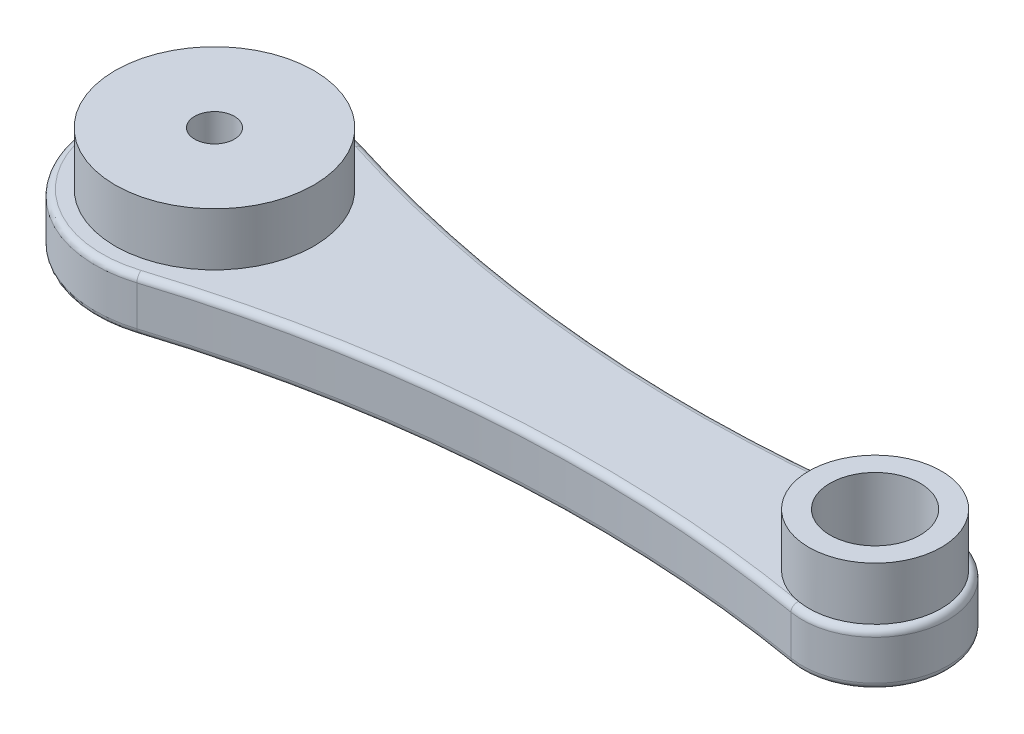
ISO-10303-21;
HEADER;
FILE_DESCRIPTION(('STEP AP214'),'2;1');
FILE_NAME('part.step','',(''),(''),'','','');
FILE_SCHEMA(('AUTOMOTIVE_DESIGN { 1 0 10303 214 1 1 1 1 }'));
ENDSEC;
DATA;
#1=APPLICATION_CONTEXT('core data for automotive mechanical design processes');
#2=APPLICATION_PROTOCOL_DEFINITION('international standard','automotive_design',2000,#1);
#3=PRODUCT_CONTEXT('',#1,'mechanical');
#4=PRODUCT('Part','Part','',(#3));
#5=PRODUCT_RELATED_PRODUCT_CATEGORY('part','',(#4));
#6=PRODUCT_DEFINITION_FORMATION('','',#4);
#7=PRODUCT_DEFINITION_CONTEXT('part definition',#1,'design');
#8=PRODUCT_DEFINITION('design','',#6,#7);
#9=PRODUCT_DEFINITION_SHAPE('','',#8);
#10=(LENGTH_UNIT() NAMED_UNIT(*) SI_UNIT(.MILLI.,.METRE.));
#11=(NAMED_UNIT(*) PLANE_ANGLE_UNIT() SI_UNIT($,.RADIAN.));
#12=(NAMED_UNIT(*) SI_UNIT($,.STERADIAN.) SOLID_ANGLE_UNIT());
#13=UNCERTAINTY_MEASURE_WITH_UNIT(LENGTH_MEASURE(1.E-05),#10,'distance_accuracy_value','');
#14=(GEOMETRIC_REPRESENTATION_CONTEXT(3) GLOBAL_UNCERTAINTY_ASSIGNED_CONTEXT((#13)) GLOBAL_UNIT_ASSIGNED_CONTEXT((#10,
#11,#12)) REPRESENTATION_CONTEXT('',''));
#15=CARTESIAN_POINT('',(0.,0.,0.));
#16=DIRECTION('',(0.,0.,1.));
#17=DIRECTION('',(1.,0.,0.));
#18=AXIS2_PLACEMENT_3D('',#15,#16,#17);
#19=CARTESIAN_POINT('',(41.1185412475084,3.99999999999994,-51.0343452144755));
#20=DIRECTION('',(0.,1.,0.));
#21=DIRECTION('',(0.,0.,1.));
#22=AXIS2_PLACEMENT_3D('',#19,#20,#21);
#23=PLANE('',#22);
#24=CARTESIAN_POINT('',(0.,3.99999999999996,0.));
#25=DIRECTION('',(0.,1.,0.));
#26=DIRECTION('',(0.,0.,1.));
#27=AXIS2_PLACEMENT_3D('',#24,#25,#26);
#28=CIRCLE('',#27,7.5);
#29=CARTESIAN_POINT('',(0.,3.99999999999996,-7.5));
#30=VERTEX_POINT('',#29);
#31=EDGE_CURVE('E227',#30,#30,#28,.T.);
#32=ORIENTED_EDGE('',*,*,#31,.F.);
#33=EDGE_LOOP('',(#32));
#34=FACE_BOUND('',#33,.T.);
#35=CARTESIAN_POINT('',(32.3370824950166,3.99999999999999,102.068690428951));
#36=DIRECTION('',(0.,1.,0.));
#37=DIRECTION('',(0.,0.,1.));
#38=AXIS2_PLACEMENT_3D('',#35,#36,#37);
#39=CIRCLE('',#38,98.5686904289509);
#40=CARTESIAN_POINT('',(2.56718560866336,3.99999999999994,8.10305856147368));
#41=VERTEX_POINT('',#40);
#42=CARTESIAN_POINT('',(49.0521126012002,3.99999999999993,4.92758429242528));
#43=VERTEX_POINT('',#42);
#44=EDGE_CURVE('E56',#41,#43,#39,.F.);
#45=ORIENTED_EDGE('',*,*,#44,.T.);
#46=CARTESIAN_POINT('',(49.9000000000001,3.99999999999995,0.));
#47=DIRECTION('',(0.,1.,0.));
#48=DIRECTION('',(0.,0.,1.));
#49=AXIS2_PLACEMENT_3D('',#46,#47,#48);
#50=CIRCLE('',#49,5.);
#51=CARTESIAN_POINT('',(49.0521126012002,3.99999999999994,-4.92758429242529));
#52=VERTEX_POINT('',#51);
#53=EDGE_CURVE('E116',#52,#43,#50,.T.);
#54=ORIENTED_EDGE('',*,*,#53,.F.);
#55=CARTESIAN_POINT('',(32.3370824950167,3.99999999999996,-102.068690428951));
#56=DIRECTION('',(0.,1.,0.));
#57=DIRECTION('',(0.,0.,1.));
#58=AXIS2_PLACEMENT_3D('',#55,#56,#57);
#59=CIRCLE('',#58,98.5686904289509);
#60=CARTESIAN_POINT('',(2.56718560866345,3.99999999999997,-8.10305856147365));
#61=VERTEX_POINT('',#60);
#62=EDGE_CURVE('E51',#52,#61,#59,.F.);
#63=ORIENTED_EDGE('',*,*,#62,.T.);
#64=CARTESIAN_POINT('',(0.,3.99999999999996,0.));
#65=DIRECTION('',(0.,1.,0.));
#66=DIRECTION('',(0.,0.,1.));
#67=AXIS2_PLACEMENT_3D('',#64,#65,#66);
#68=CIRCLE('',#67,8.50000000000001);
#69=EDGE_CURVE('E104',#61,#41,#68,.T.);
#70=ORIENTED_EDGE('',*,*,#69,.T.);
#71=EDGE_LOOP('',(#45,#54,#63,#70));
#72=FACE_BOUND('',#71,.T.);
#73=ADVANCED_FACE('F34',(#34,#72),#23,.T.);
#74=CARTESIAN_POINT('',(41.1185412475084,0.,-51.0343452144755));
#75=DIRECTION('',(0.,1.,0.));
#76=DIRECTION('',(0.,0.,1.));
#77=AXIS2_PLACEMENT_3D('',#74,#75,#76);
#78=PLANE('',#77);
#79=CARTESIAN_POINT('',(32.3370824950166,0.,102.068690428951));
#80=DIRECTION('',(0.,1.,0.));
#81=DIRECTION('',(0.,0.,1.));
#82=AXIS2_PLACEMENT_3D('',#79,#80,#81);
#83=CIRCLE('',#82,98.5686904289509);
#84=CARTESIAN_POINT('',(49.0521126012002,0.,4.92758429242524));
#85=VERTEX_POINT('',#84);
#86=CARTESIAN_POINT('',(2.56718560866335,0.,8.10305856147367));
#87=VERTEX_POINT('',#86);
#88=EDGE_CURVE('E169',#85,#87,#83,.T.);
#89=ORIENTED_EDGE('',*,*,#88,.T.);
#90=CARTESIAN_POINT('',(0.,0.,0.));
#91=DIRECTION('',(0.,1.,0.));
#92=DIRECTION('',(0.,0.,1.));
#93=AXIS2_PLACEMENT_3D('',#90,#91,#92);
#94=CIRCLE('',#93,8.50000000000001);
#95=CARTESIAN_POINT('',(2.56718560866342,0.,-8.10305856147365));
#96=VERTEX_POINT('',#95);
#97=EDGE_CURVE('E178',#87,#96,#94,.F.);
#98=ORIENTED_EDGE('',*,*,#97,.T.);
#99=CARTESIAN_POINT('',(32.3370824950167,0.,-102.068690428951));
#100=DIRECTION('',(0.,1.,0.));
#101=DIRECTION('',(0.,0.,1.));
#102=AXIS2_PLACEMENT_3D('',#99,#100,#101);
#103=CIRCLE('',#102,98.5686904289509);
#104=CARTESIAN_POINT('',(49.0521126012002,0.,-4.92758429242533));
#105=VERTEX_POINT('',#104);
#106=EDGE_CURVE('E176',#96,#105,#103,.T.);
#107=ORIENTED_EDGE('',*,*,#106,.T.);
#108=CARTESIAN_POINT('',(49.9000000000001,0.,0.));
#109=DIRECTION('',(0.,1.,0.));
#110=DIRECTION('',(0.,0.,1.));
#111=AXIS2_PLACEMENT_3D('',#108,#109,#110);
#112=CIRCLE('',#111,5.00000000000002);
#113=EDGE_CURVE('E174',#105,#85,#112,.F.);
#114=ORIENTED_EDGE('',*,*,#113,.T.);
#115=EDGE_LOOP('',(#89,#98,#107,#114));
#116=FACE_BOUND('',#115,.T.);
#117=CARTESIAN_POINT('',(0.,0.,0.));
#118=DIRECTION('',(0.,1.,0.));
#119=DIRECTION('',(0.,0.,1.));
#120=AXIS2_PLACEMENT_3D('',#117,#118,#119);
#121=CIRCLE('',#120,1.5);
#122=CARTESIAN_POINT('',(0.,0.,-1.49999999999998));
#123=VERTEX_POINT('',#122);
#124=EDGE_CURVE('E197',#123,#123,#121,.T.);
#125=ORIENTED_EDGE('',*,*,#124,.T.);
#126=EDGE_LOOP('',(#125));
#127=FACE_BOUND('',#126,.T.);
#128=CARTESIAN_POINT('',(49.9000000000001,0.,0.));
#129=DIRECTION('',(0.,1.,0.));
#130=DIRECTION('',(0.,0.,1.));
#131=AXIS2_PLACEMENT_3D('',#128,#129,#130);
#132=CIRCLE('',#131,3.4);
#133=CARTESIAN_POINT('',(49.9000000000001,0.,-3.40000000000001));
#134=VERTEX_POINT('',#133);
#135=EDGE_CURVE('E138',#134,#134,#132,.T.);
#136=ORIENTED_EDGE('',*,*,#135,.T.);
#137=EDGE_LOOP('',(#136));
#138=FACE_BOUND('',#137,.T.);
#139=ADVANCED_FACE('F214',(#116,#127,#138),#78,.F.);
#140=CARTESIAN_POINT('',(32.3370824950167,3.99999999999996,-102.068690428951));
#141=DIRECTION('',(0.,-1.,0.));
#142=DIRECTION('',(0.,0.,-1.));
#143=AXIS2_PLACEMENT_3D('',#140,#141,#142);
#144=CYLINDRICAL_SURFACE('',#143,98.0686904289509);
#145=DIRECTION('',(0.,-1.,0.));
#146=VECTOR('',#145,1.);
#147=CARTESIAN_POINT('',(48.9673238613201,3.99999999999995,-5.42034272166784));
#148=LINE('',#147,#146);
#149=CARTESIAN_POINT('',(48.9673238613201,3.49999999999996,-5.42034272166782));
#150=VERTEX_POINT('',#149);
#151=CARTESIAN_POINT('',(48.9673238613201,0.499999999999931,-5.42034272166783));
#152=VERTEX_POINT('',#151);
#153=EDGE_CURVE('E190',#150,#152,#148,.T.);
#154=ORIENTED_EDGE('',*,*,#153,.T.);
#155=CARTESIAN_POINT('',(32.3370824950167,0.499999999999959,-102.068690428951));
#156=DIRECTION('',(0.,1.,0.));
#157=DIRECTION('',(0.,0.,1.));
#158=AXIS2_PLACEMENT_3D('',#155,#156,#157);
#159=CIRCLE('',#158,98.0686904289509);
#160=CARTESIAN_POINT('',(2.71819652682011,0.499999999999973,-8.57970906508974));
#161=VERTEX_POINT('',#160);
#162=EDGE_CURVE('E183',#152,#161,#159,.F.);
#163=ORIENTED_EDGE('',*,*,#162,.T.);
#164=DIRECTION('',(0.,-1.,0.));
#165=VECTOR('',#164,1.);
#166=CARTESIAN_POINT('',(2.71819652682009,4.,-8.57970906508974));
#167=LINE('',#166,#165);
#168=CARTESIAN_POINT('',(2.71819652682008,3.49999999999998,-8.57970906508975));
#169=VERTEX_POINT('',#168);
#170=EDGE_CURVE('E164',#169,#161,#167,.T.);
#171=ORIENTED_EDGE('',*,*,#170,.F.);
#172=CARTESIAN_POINT('',(32.3370824950167,3.49999999999994,-102.068690428951));
#173=DIRECTION('',(0.,1.,0.));
#174=DIRECTION('',(0.,0.,1.));
#175=AXIS2_PLACEMENT_3D('',#172,#173,#174);
#176=CIRCLE('',#175,98.0686904289509);
#177=EDGE_CURVE('E181',#169,#150,#176,.T.);
#178=ORIENTED_EDGE('',*,*,#177,.T.);
#179=EDGE_LOOP('',(#154,#163,#171,#178));
#180=FACE_BOUND('',#179,.T.);
#181=ADVANCED_FACE('F195',(#180),#144,.F.);
#182=CARTESIAN_POINT('',(0.,3.99999999999996,0.));
#183=DIRECTION('',(0.,-1.,0.));
#184=DIRECTION('',(0.,0.,-1.));
#185=AXIS2_PLACEMENT_3D('',#182,#183,#184);
#186=CYLINDRICAL_SURFACE('',#185,9.00000000000001);
#187=ORIENTED_EDGE('',*,*,#170,.T.);
#188=CARTESIAN_POINT('',(0.,0.499999999999973,0.));
#189=DIRECTION('',(0.,1.,0.));
#190=DIRECTION('',(0.,0.,1.));
#191=AXIS2_PLACEMENT_3D('',#188,#189,#190);
#192=CIRCLE('',#191,9.00000000000001);
#193=CARTESIAN_POINT('',(2.71819652682003,0.499999999999973,8.57970906508978));
#194=VERTEX_POINT('',#193);
#195=EDGE_CURVE('E163',#161,#194,#192,.T.);
#196=ORIENTED_EDGE('',*,*,#195,.T.);
#197=DIRECTION('',(0.,-1.,0.));
#198=VECTOR('',#197,1.);
#199=CARTESIAN_POINT('',(2.71819652682002,3.99999999999998,8.57970906508978));
#200=LINE('',#199,#198);
#201=CARTESIAN_POINT('',(2.71819652682002,3.5,8.57970906508979));
#202=VERTEX_POINT('',#201);
#203=EDGE_CURVE('E151',#202,#194,#200,.T.);
#204=ORIENTED_EDGE('',*,*,#203,.F.);
#205=CARTESIAN_POINT('',(0.,3.49999999999996,0.));
#206=DIRECTION('',(0.,1.,0.));
#207=DIRECTION('',(0.,0.,1.));
#208=AXIS2_PLACEMENT_3D('',#205,#206,#207);
#209=CIRCLE('',#208,9.00000000000001);
#210=EDGE_CURVE('E160',#202,#169,#209,.F.);
#211=ORIENTED_EDGE('',*,*,#210,.T.);
#212=EDGE_LOOP('',(#187,#196,#204,#211));
#213=FACE_BOUND('',#212,.T.);
#214=ADVANCED_FACE('F159',(#213),#186,.T.);
#215=CARTESIAN_POINT('',(32.3370824950166,3.99999999999999,102.068690428951));
#216=DIRECTION('',(0.,-1.,0.));
#217=DIRECTION('',(0.,0.,-1.));
#218=AXIS2_PLACEMENT_3D('',#215,#216,#217);
#219=CYLINDRICAL_SURFACE('',#218,98.0686904289509);
#220=ORIENTED_EDGE('',*,*,#203,.T.);
#221=CARTESIAN_POINT('',(32.3370824950166,0.499999999999945,102.068690428951));
#222=DIRECTION('',(0.,1.,0.));
#223=DIRECTION('',(0.,0.,1.));
#224=AXIS2_PLACEMENT_3D('',#221,#222,#223);
#225=CIRCLE('',#224,98.0686904289509);
#226=CARTESIAN_POINT('',(48.9673238613202,0.499999999999945,5.4203427216678));
#227=VERTEX_POINT('',#226);
#228=EDGE_CURVE('E11',#194,#227,#225,.F.);
#229=ORIENTED_EDGE('',*,*,#228,.T.);
#230=DIRECTION('',(0.,-1.,0.));
#231=VECTOR('',#230,1.);
#232=CARTESIAN_POINT('',(48.9673238613202,3.99999999999995,5.4203427216678));
#233=LINE('',#232,#231);
#234=CARTESIAN_POINT('',(48.9673238613202,3.49999999999993,5.42034272166781));
#235=VERTEX_POINT('',#234);
#236=EDGE_CURVE('E153',#235,#227,#233,.T.);
#237=ORIENTED_EDGE('',*,*,#236,.F.);
#238=CARTESIAN_POINT('',(32.3370824950166,3.49999999999998,102.068690428951));
#239=DIRECTION('',(0.,1.,0.));
#240=DIRECTION('',(0.,0.,1.));
#241=AXIS2_PLACEMENT_3D('',#238,#239,#240);
#242=CIRCLE('',#241,98.0686904289509);
#243=EDGE_CURVE('E43',#235,#202,#242,.T.);
#244=ORIENTED_EDGE('',*,*,#243,.T.);
#245=EDGE_LOOP('',(#220,#229,#237,#244));
#246=FACE_BOUND('',#245,.T.);
#247=ADVANCED_FACE('F150',(#246),#219,.F.);
#248=CARTESIAN_POINT('',(49.9000000000001,3.99999999999995,0.));
#249=DIRECTION('',(0.,-1.,0.));
#250=DIRECTION('',(0.,0.,-1.));
#251=AXIS2_PLACEMENT_3D('',#248,#249,#250);
#252=CYLINDRICAL_SURFACE('',#251,5.50000000000002);
#253=ORIENTED_EDGE('',*,*,#236,.T.);
#254=CARTESIAN_POINT('',(49.9000000000001,0.499999999999945,0.));
#255=DIRECTION('',(0.,1.,0.));
#256=DIRECTION('',(0.,0.,1.));
#257=AXIS2_PLACEMENT_3D('',#254,#255,#256);
#258=CIRCLE('',#257,5.50000000000002);
#259=EDGE_CURVE('E123',#227,#152,#258,.T.);
#260=ORIENTED_EDGE('',*,*,#259,.T.);
#261=ORIENTED_EDGE('',*,*,#153,.F.);
#262=CARTESIAN_POINT('',(49.9000000000001,3.49999999999995,0.));
#263=DIRECTION('',(0.,1.,0.));
#264=DIRECTION('',(0.,0.,1.));
#265=AXIS2_PLACEMENT_3D('',#262,#263,#264);
#266=CIRCLE('',#265,5.50000000000002);
#267=EDGE_CURVE('E112',#150,#235,#266,.F.);
#268=ORIENTED_EDGE('',*,*,#267,.T.);
#269=EDGE_LOOP('',(#253,#260,#261,#268));
#270=FACE_BOUND('',#269,.T.);
#271=ADVANCED_FACE('F189',(#270),#252,.T.);
#272=CARTESIAN_POINT('',(0.,3.99999999999996,0.));
#273=DIRECTION('',(0.,-1.,0.));
#274=DIRECTION('',(0.,0.,-1.));
#275=AXIS2_PLACEMENT_3D('',#272,#273,#274);
#276=CYLINDRICAL_SURFACE('',#275,1.5);
#277=CARTESIAN_POINT('',(0.,7.99999999999997,0.));
#278=DIRECTION('',(0.,1.,0.));
#279=DIRECTION('',(0.,0.,1.));
#280=AXIS2_PLACEMENT_3D('',#277,#278,#279);
#281=CIRCLE('',#280,1.5);
#282=CARTESIAN_POINT('',(0.,7.99999999999997,-1.49999999999998));
#283=VERTEX_POINT('',#282);
#284=EDGE_CURVE('E231',#283,#283,#281,.T.);
#285=CARTESIAN_POINT('',(0.,0.,-1.49999999999998));
#286=CARTESIAN_POINT('',(0.,0.0833333333333328,-1.49999999999998));
#287=CARTESIAN_POINT('',(0.,0.166666666666666,-1.49999999999998));
#288=CARTESIAN_POINT('',(0.,0.333333333333332,-1.49999999999998));
#289=CARTESIAN_POINT('',(0.,0.416666666666665,-1.49999999999998));
#290=CARTESIAN_POINT('',(0.,0.583333333333331,-1.49999999999998));
#291=CARTESIAN_POINT('',(0.,0.666666666666664,-1.49999999999998));
#292=CARTESIAN_POINT('',(0.,0.833333333333329,-1.49999999999998));
#293=CARTESIAN_POINT('',(0.,0.916666666666663,-1.49999999999998));
#294=CARTESIAN_POINT('',(0.,1.08333333333333,-1.49999999999998));
#295=CARTESIAN_POINT('',(0.,1.16666666666666,-1.49999999999998));
#296=CARTESIAN_POINT('',(0.,1.33333333333333,-1.49999999999998));
#297=CARTESIAN_POINT('',(0.,1.41666666666666,-1.49999999999998));
#298=CARTESIAN_POINT('',(0.,1.58333333333333,-1.49999999999998));
#299=CARTESIAN_POINT('',(0.,1.66666666666666,-1.49999999999998));
#300=CARTESIAN_POINT('',(0.,1.83333333333333,-1.49999999999998));
#301=CARTESIAN_POINT('',(0.,1.91666666666666,-1.49999999999998));
#302=CARTESIAN_POINT('',(0.,2.08333333333332,-1.49999999999998));
#303=CARTESIAN_POINT('',(0.,2.16666666666666,-1.49999999999998));
#304=CARTESIAN_POINT('',(0.,2.33333333333332,-1.49999999999998));
#305=CARTESIAN_POINT('',(0.,2.41666666666666,-1.49999999999998));
#306=CARTESIAN_POINT('',(0.,2.58333333333332,-1.49999999999998));
#307=CARTESIAN_POINT('',(0.,2.66666666666666,-1.49999999999998));
#308=CARTESIAN_POINT('',(0.,2.83333333333332,-1.49999999999998));
#309=CARTESIAN_POINT('',(0.,2.91666666666665,-1.49999999999998));
#310=CARTESIAN_POINT('',(0.,3.08333333333332,-1.49999999999998));
#311=CARTESIAN_POINT('',(0.,3.16666666666665,-1.49999999999998));
#312=CARTESIAN_POINT('',(0.,3.33333333333332,-1.49999999999998));
#313=CARTESIAN_POINT('',(0.,3.41666666666665,-1.49999999999998));
#314=CARTESIAN_POINT('',(0.,3.58333333333332,-1.49999999999998));
#315=CARTESIAN_POINT('',(0.,3.66666666666665,-1.49999999999998));
#316=CARTESIAN_POINT('',(0.,3.83333333333332,-1.49999999999998));
#317=CARTESIAN_POINT('',(0.,3.91666666666665,-1.49999999999998));
#318=CARTESIAN_POINT('',(0.,4.08333333333332,-1.49999999999998));
#319=CARTESIAN_POINT('',(0.,4.16666666666665,-1.49999999999998));
#320=CARTESIAN_POINT('',(0.,4.33333333333332,-1.49999999999998));
#321=CARTESIAN_POINT('',(0.,4.41666666666665,-1.49999999999998));
#322=CARTESIAN_POINT('',(0.,4.58333333333331,-1.49999999999998));
#323=CARTESIAN_POINT('',(0.,4.66666666666665,-1.49999999999998));
#324=CARTESIAN_POINT('',(0.,4.83333333333331,-1.49999999999998));
#325=CARTESIAN_POINT('',(0.,4.91666666666665,-1.49999999999998));
#326=CARTESIAN_POINT('',(0.,5.08333333333331,-1.49999999999998));
#327=CARTESIAN_POINT('',(0.,5.16666666666665,-1.49999999999998));
#328=CARTESIAN_POINT('',(0.,5.33333333333331,-1.49999999999998));
#329=CARTESIAN_POINT('',(0.,5.41666666666664,-1.49999999999998));
#330=CARTESIAN_POINT('',(0.,5.58333333333331,-1.49999999999998));
#331=CARTESIAN_POINT('',(0.,5.66666666666664,-1.49999999999998));
#332=CARTESIAN_POINT('',(0.,5.83333333333331,-1.49999999999998));
#333=CARTESIAN_POINT('',(0.,5.91666666666664,-1.49999999999998));
#334=CARTESIAN_POINT('',(0.,6.08333333333331,-1.49999999999998));
#335=CARTESIAN_POINT('',(0.,6.16666666666664,-1.49999999999998));
#336=CARTESIAN_POINT('',(0.,6.33333333333331,-1.49999999999998));
#337=CARTESIAN_POINT('',(0.,6.41666666666664,-1.49999999999998));
#338=CARTESIAN_POINT('',(0.,6.58333333333331,-1.49999999999998));
#339=CARTESIAN_POINT('',(0.,6.66666666666664,-1.49999999999998));
#340=CARTESIAN_POINT('',(0.,6.83333333333331,-1.49999999999998));
#341=CARTESIAN_POINT('',(0.,6.91666666666664,-1.49999999999998));
#342=CARTESIAN_POINT('',(0.,7.0833333333333,-1.49999999999998));
#343=CARTESIAN_POINT('',(0.,7.16666666666664,-1.49999999999998));
#344=CARTESIAN_POINT('',(0.,7.3333333333333,-1.49999999999998));
#345=CARTESIAN_POINT('',(0.,7.41666666666664,-1.49999999999998));
#346=CARTESIAN_POINT('',(0.,7.5833333333333,-1.49999999999998));
#347=CARTESIAN_POINT('',(0.,7.66666666666664,-1.49999999999998));
#348=CARTESIAN_POINT('',(0.,7.8333333333333,-1.49999999999998));
#349=CARTESIAN_POINT('',(0.,7.91666666666663,-1.49999999999998));
#350=CARTESIAN_POINT('',(0.,7.99999999999997,-1.49999999999998));
#351=B_SPLINE_CURVE_WITH_KNOTS('',3,(#285,#286,#287,#288,#289,#290,#291,#292,#293,#294,#295,
#296,#297,#298,#299,#300,#301,#302,#303,#304,#305,#306,#307,#308,#309,#310,#311,#312,#313,#314,
#315,#316,#317,#318,#319,#320,#321,#322,#323,#324,#325,#326,#327,#328,#329,#330,#331,#332,#333,
#334,#335,#336,#337,#338,#339,#340,#341,#342,#343,#344,#345,#346,#347,#348,#349,#350),
.UNSPECIFIED.,.F.,.F.,(4,2,2,2,2,2,2,2,2,2,2,2,2,2,2,2,2,2,2,2,2,2,2,2,2,2,2,2,2,2,2,2,4),(0.,
0.249999999999999,0.499999999999998,0.749999999999996,0.999999999999996,1.24999999999999,
1.49999999999999,1.74999999999999,1.99999999999999,2.24999999999999,2.49999999999999,
2.74999999999999,2.99999999999999,3.24999999999999,3.49999999999999,3.74999999999998,
3.99999999999998,4.24999999999998,4.49999999999998,4.74999999999998,4.99999999999998,
5.24999999999998,5.49999999999998,5.74999999999998,5.99999999999998,6.24999999999997,
6.49999999999997,6.74999999999997,6.99999999999997,7.24999999999997,7.49999999999997,
7.74999999999997,7.99999999999997),.UNSPECIFIED.);
#352=EDGE_CURVE('BSEAM264',#123,#283,#351,.T.);
#353=ORIENTED_EDGE('',*,*,#124,.F.);
#354=ORIENTED_EDGE('',*,*,#284,.T.);
#355=ORIENTED_EDGE('',*,*,#352,.T.);
#356=ORIENTED_EDGE('',*,*,#352,.F.);
#357=EDGE_LOOP('',(#353,#355,#354,#356));
#358=FACE_BOUND('',#357,.T.);
#359=ADVANCED_FACE('F264',(#358),#276,.F.);
#360=CARTESIAN_POINT('',(49.9000000000001,3.99999999999995,0.));
#361=DIRECTION('',(0.,-1.,0.));
#362=DIRECTION('',(0.,0.,-1.));
#363=AXIS2_PLACEMENT_3D('',#360,#361,#362);
#364=CYLINDRICAL_SURFACE('',#363,3.4);
#365=CARTESIAN_POINT('',(49.9000000000001,7.99999999999994,0.));
#366=DIRECTION('',(0.,1.,0.));
#367=DIRECTION('',(0.,0.,1.));
#368=AXIS2_PLACEMENT_3D('',#365,#366,#367);
#369=CIRCLE('',#368,3.4);
#370=CARTESIAN_POINT('',(49.9000000000001,7.99999999999995,-3.40000000000001));
#371=VERTEX_POINT('',#370);
#372=EDGE_CURVE('E119',#371,#371,#369,.T.);
#373=CARTESIAN_POINT('',(49.9000000000001,0.,-3.40000000000001));
#374=CARTESIAN_POINT('',(49.9000000000001,0.0833333333332778,-3.40000000000001));
#375=CARTESIAN_POINT('',(49.9000000000001,0.166666666666611,-3.40000000000001));
#376=CARTESIAN_POINT('',(49.9000000000001,0.333333333333278,-3.40000000000001));
#377=CARTESIAN_POINT('',(49.9000000000001,0.416666666666611,-3.40000000000001));
#378=CARTESIAN_POINT('',(49.9000000000001,0.583333333333278,-3.40000000000001));
#379=CARTESIAN_POINT('',(49.9000000000001,0.666666666666611,-3.40000000000001));
#380=CARTESIAN_POINT('',(49.9000000000001,0.833333333333278,-3.40000000000001));
#381=CARTESIAN_POINT('',(49.9000000000001,0.916666666666611,-3.40000000000001));
#382=CARTESIAN_POINT('',(49.9000000000001,1.08333333333328,-3.40000000000001));
#383=CARTESIAN_POINT('',(49.9000000000001,1.16666666666661,-3.40000000000001));
#384=CARTESIAN_POINT('',(49.9000000000001,1.33333333333328,-3.40000000000001));
#385=CARTESIAN_POINT('',(49.9000000000001,1.41666666666661,-3.40000000000001));
#386=CARTESIAN_POINT('',(49.9000000000001,1.58333333333328,-3.40000000000001));
#387=CARTESIAN_POINT('',(49.9000000000001,1.66666666666661,-3.40000000000001));
#388=CARTESIAN_POINT('',(49.9000000000001,1.83333333333328,-3.40000000000001));
#389=CARTESIAN_POINT('',(49.9000000000001,1.91666666666661,-3.40000000000001));
#390=CARTESIAN_POINT('',(49.9000000000001,2.08333333333328,-3.40000000000001));
#391=CARTESIAN_POINT('',(49.9000000000001,2.16666666666661,-3.40000000000001));
#392=CARTESIAN_POINT('',(49.9000000000001,2.33333333333328,-3.40000000000001));
#393=CARTESIAN_POINT('',(49.9000000000001,2.41666666666661,-3.40000000000001));
#394=CARTESIAN_POINT('',(49.9000000000001,2.58333333333328,-3.40000000000001));
#395=CARTESIAN_POINT('',(49.9000000000001,2.66666666666661,-3.40000000000001));
#396=CARTESIAN_POINT('',(49.9000000000001,2.83333333333328,-3.40000000000001));
#397=CARTESIAN_POINT('',(49.9000000000001,2.91666666666661,-3.40000000000001));
#398=CARTESIAN_POINT('',(49.9000000000001,3.08333333333328,-3.40000000000001));
#399=CARTESIAN_POINT('',(49.9000000000001,3.16666666666661,-3.40000000000001));
#400=CARTESIAN_POINT('',(49.9000000000001,3.33333333333328,-3.40000000000001));
#401=CARTESIAN_POINT('',(49.9000000000001,3.41666666666661,-3.40000000000001));
#402=CARTESIAN_POINT('',(49.9000000000001,3.58333333333328,-3.40000000000001));
#403=CARTESIAN_POINT('',(49.9000000000001,3.66666666666661,-3.40000000000001));
#404=CARTESIAN_POINT('',(49.9000000000001,3.83333333333328,-3.40000000000001));
#405=CARTESIAN_POINT('',(49.9000000000001,3.91666666666661,-3.40000000000001));
#406=CARTESIAN_POINT('',(49.9000000000001,4.08333333333328,-3.40000000000001));
#407=CARTESIAN_POINT('',(49.9000000000001,4.16666666666661,-3.40000000000001));
#408=CARTESIAN_POINT('',(49.9000000000001,4.33333333333328,-3.40000000000001));
#409=CARTESIAN_POINT('',(49.9000000000001,4.41666666666661,-3.40000000000001));
#410=CARTESIAN_POINT('',(49.9000000000001,4.58333333333328,-3.40000000000001));
#411=CARTESIAN_POINT('',(49.9000000000001,4.66666666666661,-3.40000000000001));
#412=CARTESIAN_POINT('',(49.9000000000001,4.83333333333328,-3.40000000000001));
#413=CARTESIAN_POINT('',(49.9000000000001,4.91666666666661,-3.40000000000001));
#414=CARTESIAN_POINT('',(49.9000000000001,5.08333333333328,-3.40000000000001));
#415=CARTESIAN_POINT('',(49.9000000000001,5.16666666666661,-3.40000000000001));
#416=CARTESIAN_POINT('',(49.9000000000001,5.33333333333328,-3.40000000000001));
#417=CARTESIAN_POINT('',(49.9000000000001,5.41666666666661,-3.40000000000001));
#418=CARTESIAN_POINT('',(49.9000000000001,5.58333333333328,-3.40000000000001));
#419=CARTESIAN_POINT('',(49.9000000000001,5.66666666666661,-3.40000000000001));
#420=CARTESIAN_POINT('',(49.9000000000001,5.83333333333328,-3.40000000000001));
#421=CARTESIAN_POINT('',(49.9000000000001,5.91666666666661,-3.40000000000001));
#422=CARTESIAN_POINT('',(49.9000000000001,6.08333333333328,-3.40000000000001));
#423=CARTESIAN_POINT('',(49.9000000000001,6.16666666666661,-3.40000000000001));
#424=CARTESIAN_POINT('',(49.9000000000001,6.33333333333328,-3.40000000000001));
#425=CARTESIAN_POINT('',(49.9000000000001,6.41666666666661,-3.40000000000001));
#426=CARTESIAN_POINT('',(49.9000000000001,6.58333333333328,-3.40000000000001));
#427=CARTESIAN_POINT('',(49.9000000000001,6.66666666666661,-3.40000000000001));
#428=CARTESIAN_POINT('',(49.9000000000001,6.83333333333328,-3.40000000000001));
#429=CARTESIAN_POINT('',(49.9000000000001,6.91666666666661,-3.40000000000001));
#430=CARTESIAN_POINT('',(49.9000000000001,7.08333333333328,-3.40000000000001));
#431=CARTESIAN_POINT('',(49.9000000000001,7.16666666666661,-3.40000000000001));
#432=CARTESIAN_POINT('',(49.9000000000001,7.33333333333328,-3.40000000000001));
#433=CARTESIAN_POINT('',(49.9000000000001,7.41666666666661,-3.40000000000001));
#434=CARTESIAN_POINT('',(49.9000000000001,7.58333333333328,-3.40000000000001));
#435=CARTESIAN_POINT('',(49.9000000000001,7.66666666666661,-3.40000000000001));
#436=CARTESIAN_POINT('',(49.9000000000001,7.83333333333328,-3.40000000000001));
#437=CARTESIAN_POINT('',(49.9000000000001,7.91666666666661,-3.40000000000001));
#438=CARTESIAN_POINT('',(49.9000000000001,7.99999999999995,-3.40000000000001));
#439=B_SPLINE_CURVE_WITH_KNOTS('',3,(#373,#374,#375,#376,#377,#378,#379,#380,#381,#382,#383,
#384,#385,#386,#387,#388,#389,#390,#391,#392,#393,#394,#395,#396,#397,#398,#399,#400,#401,#402,
#403,#404,#405,#406,#407,#408,#409,#410,#411,#412,#413,#414,#415,#416,#417,#418,#419,#420,#421,
#422,#423,#424,#425,#426,#427,#428,#429,#430,#431,#432,#433,#434,#435,#436,#437,#438),
.UNSPECIFIED.,.F.,.F.,(4,2,2,2,2,2,2,2,2,2,2,2,2,2,2,2,2,2,2,2,2,2,2,2,2,2,2,2,2,2,2,2,4),(0.,
0.25,0.5,0.75,1.,1.25,1.5,1.75,2.,2.25,2.5,2.75,3.,3.25,3.5,3.75,4.,4.25,4.5,4.75,5.,5.25,5.5,
5.75,6.,6.25,6.5,6.75,7.,7.25,7.5,7.75,8.),.UNSPECIFIED.);
#440=EDGE_CURVE('BSEAM241',#134,#371,#439,.T.);
#441=ORIENTED_EDGE('',*,*,#135,.F.);
#442=ORIENTED_EDGE('',*,*,#372,.T.);
#443=ORIENTED_EDGE('',*,*,#440,.T.);
#444=ORIENTED_EDGE('',*,*,#440,.F.);
#445=EDGE_LOOP('',(#441,#443,#442,#444));
#446=FACE_BOUND('',#445,.T.);
#447=ADVANCED_FACE('F241',(#446),#364,.F.);
#448=CARTESIAN_POINT('',(49.9000000000001,0.499999999999945,0.));
#449=DIRECTION('',(0.,1.,0.));
#450=DIRECTION('',(0.,0.,1.));
#451=AXIS2_PLACEMENT_3D('',#448,#449,#450);
#452=TOROIDAL_SURFACE('',#451,5.00000000000002,0.5);
#453=CARTESIAN_POINT('',(49.0521126012001,0.499999999999945,4.9275842924253));
#454=DIRECTION('',(-0.985516858485056,0.,-0.169577479759985));
#455=DIRECTION('',(-0.169577479759987,0.,0.985516858485055));
#456=AXIS2_PLACEMENT_3D('',#453,#454,#455);
#457=CIRCLE('',#456,0.5);
#458=EDGE_CURVE('E132',#85,#227,#457,.T.);
#459=ORIENTED_EDGE('',*,*,#458,.F.);
#460=ORIENTED_EDGE('',*,*,#113,.F.);
#461=CARTESIAN_POINT('',(49.0521126012001,0.499999999999959,-4.92758429242529));
#462=DIRECTION('',(-0.985516858485057,0.,0.169577479759986));
#463=DIRECTION('',(0.169577479759986,0.,0.985516858485055));
#464=AXIS2_PLACEMENT_3D('',#461,#462,#463);
#465=CIRCLE('',#464,0.5);
#466=EDGE_CURVE('E135',#152,#105,#465,.T.);
#467=ORIENTED_EDGE('',*,*,#466,.F.);
#468=ORIENTED_EDGE('',*,*,#259,.F.);
#469=EDGE_LOOP('',(#459,#460,#467,#468));
#470=FACE_BOUND('',#469,.T.);
#471=ADVANCED_FACE('F200',(#470),#452,.T.);
#472=CARTESIAN_POINT('',(32.3370824950167,0.499999999999959,-102.068690428951));
#473=DIRECTION('',(0.,1.,0.));
#474=DIRECTION('',(0.,0.,1.));
#475=AXIS2_PLACEMENT_3D('',#472,#473,#474);
#476=TOROIDAL_SURFACE('',#475,98.5686904289509,0.5);
#477=ORIENTED_EDGE('',*,*,#466,.T.);
#478=ORIENTED_EDGE('',*,*,#106,.F.);
#479=CARTESIAN_POINT('',(2.56718560866343,0.499999999999987,-8.10305856147364));
#480=DIRECTION('',(-0.953301007232196,0.,-0.302021836313342));
#481=DIRECTION('',(-0.302021836313344,0.,0.953301007232194));
#482=AXIS2_PLACEMENT_3D('',#479,#480,#481);
#483=CIRCLE('',#482,0.5);
#484=EDGE_CURVE('E130',#161,#96,#483,.T.);
#485=ORIENTED_EDGE('',*,*,#484,.F.);
#486=ORIENTED_EDGE('',*,*,#162,.F.);
#487=EDGE_LOOP('',(#477,#478,#485,#486));
#488=FACE_BOUND('',#487,.T.);
#489=ADVANCED_FACE('F204',(#488),#476,.T.);
#490=CARTESIAN_POINT('',(32.3370824950166,0.499999999999945,102.068690428951));
#491=DIRECTION('',(0.,1.,0.));
#492=DIRECTION('',(0.,0.,1.));
#493=AXIS2_PLACEMENT_3D('',#490,#491,#492);
#494=TOROIDAL_SURFACE('',#493,98.5686904289509,0.5);
#495=ORIENTED_EDGE('',*,*,#458,.T.);
#496=ORIENTED_EDGE('',*,*,#228,.F.);
#497=CARTESIAN_POINT('',(2.56718560866336,0.499999999999973,8.10305856147368));
#498=DIRECTION('',(-0.953301007232198,0.,0.302021836313337));
#499=DIRECTION('',(0.302021836313336,0.,0.953301007232197));
#500=AXIS2_PLACEMENT_3D('',#497,#498,#499);
#501=CIRCLE('',#500,0.5);
#502=EDGE_CURVE('E113',#87,#194,#501,.T.);
#503=ORIENTED_EDGE('',*,*,#502,.F.);
#504=ORIENTED_EDGE('',*,*,#88,.F.);
#505=EDGE_LOOP('',(#495,#496,#503,#504));
#506=FACE_BOUND('',#505,.T.);
#507=ADVANCED_FACE('F212',(#506),#494,.T.);
#508=CARTESIAN_POINT('',(0.,0.499999999999973,0.));
#509=DIRECTION('',(0.,1.,0.));
#510=DIRECTION('',(0.,0.,1.));
#511=AXIS2_PLACEMENT_3D('',#508,#509,#510);
#512=TOROIDAL_SURFACE('',#511,8.50000000000001,0.5);
#513=ORIENTED_EDGE('',*,*,#484,.T.);
#514=ORIENTED_EDGE('',*,*,#97,.F.);
#515=ORIENTED_EDGE('',*,*,#502,.T.);
#516=ORIENTED_EDGE('',*,*,#195,.F.);
#517=EDGE_LOOP('',(#513,#514,#515,#516));
#518=FACE_BOUND('',#517,.T.);
#519=ADVANCED_FACE('F207',(#518),#512,.T.);
#520=CARTESIAN_POINT('',(49.9000000000001,3.49999999999995,0.));
#521=DIRECTION('',(0.,1.,0.));
#522=DIRECTION('',(0.,0.,1.));
#523=AXIS2_PLACEMENT_3D('',#520,#521,#522);
#524=TOROIDAL_SURFACE('',#523,5.00000000000002,0.5);
#525=CARTESIAN_POINT('',(49.0521126012002,3.49999999999994,4.92758429242527));
#526=DIRECTION('',(-0.985516858485056,0.,-0.169577479759985));
#527=DIRECTION('',(-0.169577479759987,0.,0.985516858485055));
#528=AXIS2_PLACEMENT_3D('',#525,#526,#527);
#529=CIRCLE('',#528,0.5);
#530=EDGE_CURVE('E114',#235,#43,#529,.T.);
#531=ORIENTED_EDGE('',*,*,#530,.F.);
#532=ORIENTED_EDGE('',*,*,#267,.F.);
#533=CARTESIAN_POINT('',(49.0521126012002,3.49999999999996,-4.92758429242531));
#534=DIRECTION('',(-0.985516858485056,0.,0.169577479759986));
#535=DIRECTION('',(0.169577479759986,0.,0.985516858485055));
#536=AXIS2_PLACEMENT_3D('',#533,#534,#535);
#537=CIRCLE('',#536,0.5);
#538=EDGE_CURVE('E38',#52,#150,#537,.T.);
#539=ORIENTED_EDGE('',*,*,#538,.F.);
#540=CARTESIAN_POINT('',(49.9000000000001,3.99999999999995,0.));
#541=DIRECTION('',(0.,1.,0.));
#542=DIRECTION('',(0.,0.,1.));
#543=AXIS2_PLACEMENT_3D('',#540,#541,#542);
#544=CIRCLE('',#543,5.00000000000002);
#545=EDGE_CURVE('E105',#43,#52,#544,.T.);
#546=ORIENTED_EDGE('',*,*,#545,.F.);
#547=EDGE_LOOP('',(#531,#532,#539,#546));
#548=FACE_BOUND('',#547,.T.);
#549=ADVANCED_FACE('F36',(#548),#524,.T.);
#550=CARTESIAN_POINT('',(32.3370824950167,3.49999999999994,-102.068690428951));
#551=DIRECTION('',(0.,1.,0.));
#552=DIRECTION('',(0.,0.,1.));
#553=AXIS2_PLACEMENT_3D('',#550,#551,#552);
#554=TOROIDAL_SURFACE('',#553,98.5686904289509,0.5);
#555=ORIENTED_EDGE('',*,*,#538,.T.);
#556=ORIENTED_EDGE('',*,*,#177,.F.);
#557=CARTESIAN_POINT('',(2.56718560866341,3.49999999999998,-8.10305856147367));
#558=DIRECTION('',(-0.953301007232196,0.,-0.302021836313343));
#559=DIRECTION('',(-0.302021836313344,0.,0.953301007232194));
#560=AXIS2_PLACEMENT_3D('',#557,#558,#559);
#561=CIRCLE('',#560,0.5);
#562=EDGE_CURVE('E102',#61,#169,#561,.T.);
#563=ORIENTED_EDGE('',*,*,#562,.F.);
#564=ORIENTED_EDGE('',*,*,#62,.F.);
#565=EDGE_LOOP('',(#555,#556,#563,#564));
#566=FACE_BOUND('',#565,.T.);
#567=ADVANCED_FACE('F100',(#566),#554,.T.);
#568=CARTESIAN_POINT('',(32.3370824950166,3.49999999999998,102.068690428951));
#569=DIRECTION('',(0.,1.,0.));
#570=DIRECTION('',(0.,0.,1.));
#571=AXIS2_PLACEMENT_3D('',#568,#569,#570);
#572=TOROIDAL_SURFACE('',#571,98.5686904289509,0.5);
#573=ORIENTED_EDGE('',*,*,#530,.T.);
#574=ORIENTED_EDGE('',*,*,#44,.F.);
#575=CARTESIAN_POINT('',(2.56718560866336,3.49999999999998,8.10305856147371));
#576=DIRECTION('',(-0.953301007232196,0.,0.302021836313344));
#577=DIRECTION('',(0.302021836313344,0.,0.953301007232194));
#578=AXIS2_PLACEMENT_3D('',#575,#576,#577);
#579=CIRCLE('',#578,0.5);
#580=EDGE_CURVE('E139',#202,#41,#579,.T.);
#581=ORIENTED_EDGE('',*,*,#580,.F.);
#582=ORIENTED_EDGE('',*,*,#243,.F.);
#583=EDGE_LOOP('',(#573,#574,#581,#582));
#584=FACE_BOUND('',#583,.T.);
#585=ADVANCED_FACE('F144',(#584),#572,.T.);
#586=CARTESIAN_POINT('',(0.,3.49999999999996,0.));
#587=DIRECTION('',(0.,1.,0.));
#588=DIRECTION('',(0.,0.,1.));
#589=AXIS2_PLACEMENT_3D('',#586,#587,#588);
#590=TOROIDAL_SURFACE('',#589,8.50000000000001,0.5);
#591=ORIENTED_EDGE('',*,*,#562,.T.);
#592=ORIENTED_EDGE('',*,*,#210,.F.);
#593=ORIENTED_EDGE('',*,*,#580,.T.);
#594=ORIENTED_EDGE('',*,*,#69,.F.);
#595=EDGE_LOOP('',(#591,#592,#593,#594));
#596=FACE_BOUND('',#595,.T.);
#597=ADVANCED_FACE('F167',(#596),#590,.T.);
#598=CARTESIAN_POINT('',(0.,7.99999999999997,0.));
#599=DIRECTION('',(0.,1.,0.));
#600=DIRECTION('',(0.,0.,1.));
#601=AXIS2_PLACEMENT_3D('',#598,#599,#600);
#602=PLANE('',#601);
#603=CARTESIAN_POINT('',(0.,7.99999999999997,0.));
#604=DIRECTION('',(0.,1.,0.));
#605=DIRECTION('',(0.,0.,1.));
#606=AXIS2_PLACEMENT_3D('',#603,#604,#605);
#607=CIRCLE('',#606,7.5);
#608=CARTESIAN_POINT('',(0.,7.99999999999997,-7.5));
#609=VERTEX_POINT('',#608);
#610=EDGE_CURVE('E141',#609,#609,#607,.T.);
#611=ORIENTED_EDGE('',*,*,#610,.T.);
#612=EDGE_LOOP('',(#611));
#613=FACE_BOUND('',#612,.T.);
#614=ORIENTED_EDGE('',*,*,#284,.F.);
#615=EDGE_LOOP('',(#614));
#616=FACE_BOUND('',#615,.T.);
#617=ADVANCED_FACE('F254',(#613,#616),#602,.T.);
#618=CARTESIAN_POINT('',(0.,7.99999999999997,0.));
#619=DIRECTION('',(0.,-1.,0.));
#620=DIRECTION('',(0.,0.,-1.));
#621=AXIS2_PLACEMENT_3D('',#618,#619,#620);
#622=CYLINDRICAL_SURFACE('',#621,7.5);
#623=CARTESIAN_POINT('',(0.,7.99999999999997,-7.5));
#624=CARTESIAN_POINT('',(0.,7.9583333333333,-7.5));
#625=CARTESIAN_POINT('',(0.,7.91666666666663,-7.5));
#626=CARTESIAN_POINT('',(0.,7.8333333333333,-7.5));
#627=CARTESIAN_POINT('',(0.,7.79166666666663,-7.5));
#628=CARTESIAN_POINT('',(0.,7.7083333333333,-7.5));
#629=CARTESIAN_POINT('',(0.,7.66666666666663,-7.5));
#630=CARTESIAN_POINT('',(0.,7.5833333333333,-7.5));
#631=CARTESIAN_POINT('',(0.,7.54166666666663,-7.5));
#632=CARTESIAN_POINT('',(0.,7.4583333333333,-7.5));
#633=CARTESIAN_POINT('',(0.,7.41666666666663,-7.5));
#634=CARTESIAN_POINT('',(0.,7.3333333333333,-7.5));
#635=CARTESIAN_POINT('',(0.,7.29166666666663,-7.5));
#636=CARTESIAN_POINT('',(0.,7.2083333333333,-7.5));
#637=CARTESIAN_POINT('',(0.,7.16666666666663,-7.5));
#638=CARTESIAN_POINT('',(0.,7.0833333333333,-7.5));
#639=CARTESIAN_POINT('',(0.,7.04166666666663,-7.5));
#640=CARTESIAN_POINT('',(0.,6.9583333333333,-7.5));
#641=CARTESIAN_POINT('',(0.,6.91666666666663,-7.5));
#642=CARTESIAN_POINT('',(0.,6.8333333333333,-7.5));
#643=CARTESIAN_POINT('',(0.,6.79166666666663,-7.5));
#644=CARTESIAN_POINT('',(0.,6.7083333333333,-7.5));
#645=CARTESIAN_POINT('',(0.,6.66666666666663,-7.5));
#646=CARTESIAN_POINT('',(0.,6.5833333333333,-7.5));
#647=CARTESIAN_POINT('',(0.,6.54166666666663,-7.5));
#648=CARTESIAN_POINT('',(0.,6.4583333333333,-7.5));
#649=CARTESIAN_POINT('',(0.,6.41666666666663,-7.5));
#650=CARTESIAN_POINT('',(0.,6.3333333333333,-7.5));
#651=CARTESIAN_POINT('',(0.,6.29166666666663,-7.5));
#652=CARTESIAN_POINT('',(0.,6.2083333333333,-7.5));
#653=CARTESIAN_POINT('',(0.,6.16666666666663,-7.5));
#654=CARTESIAN_POINT('',(0.,6.0833333333333,-7.5));
#655=CARTESIAN_POINT('',(0.,6.04166666666663,-7.5));
#656=CARTESIAN_POINT('',(0.,5.9583333333333,-7.5));
#657=CARTESIAN_POINT('',(0.,5.91666666666663,-7.5));
#658=CARTESIAN_POINT('',(0.,5.8333333333333,-7.5));
#659=CARTESIAN_POINT('',(0.,5.79166666666663,-7.5));
#660=CARTESIAN_POINT('',(0.,5.7083333333333,-7.5));
#661=CARTESIAN_POINT('',(0.,5.66666666666663,-7.5));
#662=CARTESIAN_POINT('',(0.,5.5833333333333,-7.5));
#663=CARTESIAN_POINT('',(0.,5.54166666666663,-7.5));
#664=CARTESIAN_POINT('',(0.,5.4583333333333,-7.5));
#665=CARTESIAN_POINT('',(0.,5.41666666666663,-7.5));
#666=CARTESIAN_POINT('',(0.,5.3333333333333,-7.5));
#667=CARTESIAN_POINT('',(0.,5.29166666666663,-7.5));
#668=CARTESIAN_POINT('',(0.,5.2083333333333,-7.5));
#669=CARTESIAN_POINT('',(0.,5.16666666666663,-7.5));
#670=CARTESIAN_POINT('',(0.,5.0833333333333,-7.5));
#671=CARTESIAN_POINT('',(0.,5.04166666666663,-7.5));
#672=CARTESIAN_POINT('',(0.,4.9583333333333,-7.5));
#673=CARTESIAN_POINT('',(0.,4.91666666666663,-7.5));
#674=CARTESIAN_POINT('',(0.,4.8333333333333,-7.5));
#675=CARTESIAN_POINT('',(0.,4.79166666666663,-7.5));
#676=CARTESIAN_POINT('',(0.,4.7083333333333,-7.5));
#677=CARTESIAN_POINT('',(0.,4.66666666666663,-7.5));
#678=CARTESIAN_POINT('',(0.,4.5833333333333,-7.5));
#679=CARTESIAN_POINT('',(0.,4.54166666666663,-7.5));
#680=CARTESIAN_POINT('',(0.,4.4583333333333,-7.5));
#681=CARTESIAN_POINT('',(0.,4.41666666666663,-7.5));
#682=CARTESIAN_POINT('',(0.,4.3333333333333,-7.5));
#683=CARTESIAN_POINT('',(0.,4.29166666666663,-7.5));
#684=CARTESIAN_POINT('',(0.,4.2083333333333,-7.5));
#685=CARTESIAN_POINT('',(0.,4.16666666666663,-7.5));
#686=CARTESIAN_POINT('',(0.,4.0833333333333,-7.5));
#687=CARTESIAN_POINT('',(0.,4.04166666666663,-7.5));
#688=CARTESIAN_POINT('',(0.,3.99999999999996,-7.5));
#689=B_SPLINE_CURVE_WITH_KNOTS('',3,(#623,#624,#625,#626,#627,#628,#629,#630,#631,#632,#633,
#634,#635,#636,#637,#638,#639,#640,#641,#642,#643,#644,#645,#646,#647,#648,#649,#650,#651,#652,
#653,#654,#655,#656,#657,#658,#659,#660,#661,#662,#663,#664,#665,#666,#667,#668,#669,#670,#671,
#672,#673,#674,#675,#676,#677,#678,#679,#680,#681,#682,#683,#684,#685,#686,#687,#688),
.UNSPECIFIED.,.F.,.F.,(4,2,2,2,2,2,2,2,2,2,2,2,2,2,2,2,2,2,2,2,2,2,2,2,2,2,2,2,2,2,2,2,4),(0.,
0.125000000000002,0.250000000000001,0.375000000000001,0.500000000000001,0.625000000000001,
0.750000000000002,0.875000000000002,1.,1.125,1.25,1.375,1.5,1.625,1.75,1.875,2.,2.125,2.25,
2.375,2.5,2.625,2.75,2.875,3.,3.125,3.25,3.375,3.5,3.625,3.75,3.87500000000001,
4.00000000000001),.UNSPECIFIED.);
#690=EDGE_CURVE('BSEAM245',#609,#30,#689,.T.);
#691=ORIENTED_EDGE('',*,*,#610,.F.);
#692=ORIENTED_EDGE('',*,*,#31,.T.);
#693=ORIENTED_EDGE('',*,*,#690,.T.);
#694=ORIENTED_EDGE('',*,*,#690,.F.);
#695=EDGE_LOOP('',(#691,#693,#692,#694));
#696=FACE_BOUND('',#695,.T.);
#697=ADVANCED_FACE('F245',(#696),#622,.T.);
#698=CARTESIAN_POINT('',(49.9000000000001,7.99999999999994,0.));
#699=DIRECTION('',(0.,1.,0.));
#700=DIRECTION('',(0.,0.,1.));
#701=AXIS2_PLACEMENT_3D('',#698,#699,#700);
#702=PLANE('',#701);
#703=CARTESIAN_POINT('',(49.9000000000001,7.99999999999994,0.));
#704=DIRECTION('',(0.,1.,0.));
#705=DIRECTION('',(0.,0.,1.));
#706=AXIS2_PLACEMENT_3D('',#703,#704,#705);
#707=CIRCLE('',#706,5.);
#708=CARTESIAN_POINT('',(49.9000000000001,7.99999999999994,4.99999999999998));
#709=VERTEX_POINT('',#708);
#710=EDGE_CURVE('E118',#709,#709,#707,.T.);
#711=ORIENTED_EDGE('',*,*,#710,.T.);
#712=EDGE_LOOP('',(#711));
#713=FACE_BOUND('',#712,.T.);
#714=ORIENTED_EDGE('',*,*,#372,.F.);
#715=EDGE_LOOP('',(#714));
#716=FACE_BOUND('',#715,.T.);
#717=ADVANCED_FACE('F243',(#713,#716),#702,.T.);
#718=CARTESIAN_POINT('',(49.9000000000001,7.99999999999994,0.));
#719=DIRECTION('',(0.,-1.,0.));
#720=DIRECTION('',(0.,0.,-1.));
#721=AXIS2_PLACEMENT_3D('',#718,#719,#720);
#722=CYLINDRICAL_SURFACE('',#721,5.);
#723=ORIENTED_EDGE('',*,*,#710,.F.);
#724=EDGE_LOOP('',(#723));
#725=FACE_BOUND('',#724,.T.);
#726=ORIENTED_EDGE('',*,*,#53,.T.);
#727=ORIENTED_EDGE('',*,*,#545,.T.);
#728=EDGE_LOOP('',(#726,#727));
#729=FACE_BOUND('',#728,.T.);
#730=ADVANCED_FACE('F121',(#725,#729),#722,.T.);
#731=CLOSED_SHELL('',(#73,#139,#181,#214,#247,#271,#359,#447,#471,#489,#507,#519,#549,#567,#585,
#597,#617,#697,#717,#730));
#732=MANIFOLD_SOLID_BREP('B2',#731);
#733=ADVANCED_BREP_SHAPE_REPRESENTATION('',(#18,#732),#14);
#734=SHAPE_DEFINITION_REPRESENTATION(#9,#733);
ENDSEC;
END-ISO-10303-21;
